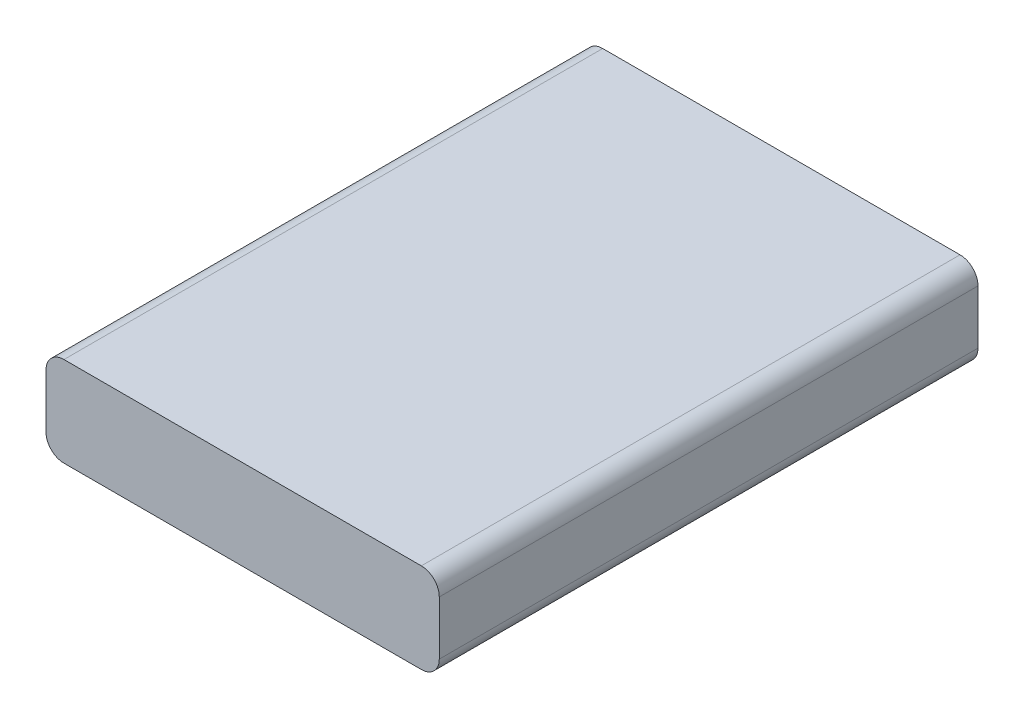
ISO-10303-21;
HEADER;
FILE_DESCRIPTION(('STEP AP214'),'2;1');
FILE_NAME('part.step','',(''),(''),'','','');
FILE_SCHEMA(('AUTOMOTIVE_DESIGN { 1 0 10303 214 1 1 1 1 }'));
ENDSEC;
DATA;
#1=APPLICATION_CONTEXT('core data for automotive mechanical design processes');
#2=APPLICATION_PROTOCOL_DEFINITION('international standard','automotive_design',2000,#1);
#3=PRODUCT_CONTEXT('',#1,'mechanical');
#4=PRODUCT('Part','Part','',(#3));
#5=PRODUCT_RELATED_PRODUCT_CATEGORY('part','',(#4));
#6=PRODUCT_DEFINITION_FORMATION('','',#4);
#7=PRODUCT_DEFINITION_CONTEXT('part definition',#1,'design');
#8=PRODUCT_DEFINITION('design','',#6,#7);
#9=PRODUCT_DEFINITION_SHAPE('','',#8);
#10=(LENGTH_UNIT() NAMED_UNIT(*) SI_UNIT(.MILLI.,.METRE.));
#11=(NAMED_UNIT(*) PLANE_ANGLE_UNIT() SI_UNIT($,.RADIAN.));
#12=(NAMED_UNIT(*) SI_UNIT($,.STERADIAN.) SOLID_ANGLE_UNIT());
#13=UNCERTAINTY_MEASURE_WITH_UNIT(LENGTH_MEASURE(1.E-05),#10,'distance_accuracy_value','');
#14=(GEOMETRIC_REPRESENTATION_CONTEXT(3) GLOBAL_UNCERTAINTY_ASSIGNED_CONTEXT((#13)) GLOBAL_UNIT_ASSIGNED_CONTEXT((#10,
#11,#12)) REPRESENTATION_CONTEXT('',''));
#15=CARTESIAN_POINT('',(0.,0.,0.));
#16=DIRECTION('',(0.,0.,1.));
#17=DIRECTION('',(1.,0.,0.));
#18=AXIS2_PLACEMENT_3D('',#15,#16,#17);
#19=CARTESIAN_POINT('',(10.95,2.5,30.));
#20=DIRECTION('',(-1.,0.,0.));
#21=DIRECTION('',(0.,0.,1.));
#22=AXIS2_PLACEMENT_3D('',#19,#20,#21);
#23=PLANE('',#22);
#24=DIRECTION('',(0.,1.,0.));
#25=VECTOR('',#24,1.);
#26=CARTESIAN_POINT('',(10.95,2.5,30.));
#27=LINE('',#26,#25);
#28=CARTESIAN_POINT('',(10.95,-1.5,30.));
#29=VERTEX_POINT('',#28);
#30=CARTESIAN_POINT('',(10.95,1.5,30.));
#31=VERTEX_POINT('',#30);
#32=EDGE_CURVE('E135',#29,#31,#27,.T.);
#33=ORIENTED_EDGE('',*,*,#32,.F.);
#34=DIRECTION('',(0.,0.,-1.));
#35=VECTOR('',#34,1.);
#36=CARTESIAN_POINT('',(10.95,-1.5,30.));
#37=LINE('',#36,#35);
#38=CARTESIAN_POINT('',(10.95,-1.5,0.));
#39=VERTEX_POINT('',#38);
#40=EDGE_CURVE('E157',#29,#39,#37,.T.);
#41=ORIENTED_EDGE('',*,*,#40,.T.);
#42=DIRECTION('',(0.,1.,0.));
#43=VECTOR('',#42,1.);
#44=CARTESIAN_POINT('',(10.95,2.5,0.));
#45=LINE('',#44,#43);
#46=CARTESIAN_POINT('',(10.95,1.5,0.));
#47=VERTEX_POINT('',#46);
#48=EDGE_CURVE('E134',#39,#47,#45,.T.);
#49=ORIENTED_EDGE('',*,*,#48,.T.);
#50=DIRECTION('',(0.,0.,-1.));
#51=VECTOR('',#50,1.);
#52=CARTESIAN_POINT('',(10.95,1.5,30.));
#53=LINE('',#52,#51);
#54=EDGE_CURVE('E146',#47,#31,#53,.F.);
#55=ORIENTED_EDGE('',*,*,#54,.T.);
#56=EDGE_LOOP('',(#33,#41,#49,#55));
#57=FACE_BOUND('',#56,.T.);
#58=ADVANCED_FACE('F43',(#57),#23,.F.);
#59=CARTESIAN_POINT('',(-10.95,2.5,30.));
#60=DIRECTION('',(0.,-1.,0.));
#61=DIRECTION('',(0.,0.,-1.));
#62=AXIS2_PLACEMENT_3D('',#59,#60,#61);
#63=PLANE('',#62);
#64=DIRECTION('',(-1.,0.,0.));
#65=VECTOR('',#64,1.);
#66=CARTESIAN_POINT('',(-10.95,2.5,0.));
#67=LINE('',#66,#65);
#68=CARTESIAN_POINT('',(9.95,2.5,0.));
#69=VERTEX_POINT('',#68);
#70=CARTESIAN_POINT('',(-9.95,2.5,0.));
#71=VERTEX_POINT('',#70);
#72=EDGE_CURVE('E149',#69,#71,#67,.T.);
#73=ORIENTED_EDGE('',*,*,#72,.T.);
#74=DIRECTION('',(0.,0.,-1.));
#75=VECTOR('',#74,1.);
#76=CARTESIAN_POINT('',(-9.95,2.5,30.));
#77=LINE('',#76,#75);
#78=CARTESIAN_POINT('',(-9.95,2.5,30.));
#79=VERTEX_POINT('',#78);
#80=EDGE_CURVE('E11',#71,#79,#77,.F.);
#81=ORIENTED_EDGE('',*,*,#80,.T.);
#82=DIRECTION('',(-1.,0.,0.));
#83=VECTOR('',#82,1.);
#84=CARTESIAN_POINT('',(-10.95,2.5,30.));
#85=LINE('',#84,#83);
#86=CARTESIAN_POINT('',(9.95,2.5,30.));
#87=VERTEX_POINT('',#86);
#88=EDGE_CURVE('E138',#87,#79,#85,.T.);
#89=ORIENTED_EDGE('',*,*,#88,.F.);
#90=DIRECTION('',(0.,0.,-1.));
#91=VECTOR('',#90,1.);
#92=CARTESIAN_POINT('',(9.95,2.5,30.));
#93=LINE('',#92,#91);
#94=EDGE_CURVE('E51',#87,#69,#93,.T.);
#95=ORIENTED_EDGE('',*,*,#94,.T.);
#96=EDGE_LOOP('',(#73,#81,#89,#95));
#97=FACE_BOUND('',#96,.T.);
#98=ADVANCED_FACE('F188',(#97),#63,.F.);
#99=CARTESIAN_POINT('',(-10.95,2.5,30.));
#100=DIRECTION('',(1.,0.,0.));
#101=DIRECTION('',(0.,0.,-1.));
#102=AXIS2_PLACEMENT_3D('',#99,#100,#101);
#103=PLANE('',#102);
#104=DIRECTION('',(0.,-1.,0.));
#105=VECTOR('',#104,1.);
#106=CARTESIAN_POINT('',(-10.95,2.5,0.));
#107=LINE('',#106,#105);
#108=CARTESIAN_POINT('',(-10.95,1.5,0.));
#109=VERTEX_POINT('',#108);
#110=CARTESIAN_POINT('',(-10.95,-1.5,0.));
#111=VERTEX_POINT('',#110);
#112=EDGE_CURVE('E152',#109,#111,#107,.T.);
#113=ORIENTED_EDGE('',*,*,#112,.T.);
#114=DIRECTION('',(0.,0.,-1.));
#115=VECTOR('',#114,1.);
#116=CARTESIAN_POINT('',(-10.95,-1.5,30.));
#117=LINE('',#116,#115);
#118=CARTESIAN_POINT('',(-10.95,-1.5,30.));
#119=VERTEX_POINT('',#118);
#120=EDGE_CURVE('E58',#111,#119,#117,.F.);
#121=ORIENTED_EDGE('',*,*,#120,.T.);
#122=DIRECTION('',(0.,-1.,0.));
#123=VECTOR('',#122,1.);
#124=CARTESIAN_POINT('',(-10.95,2.5,30.));
#125=LINE('',#124,#123);
#126=CARTESIAN_POINT('',(-10.95,1.5,30.));
#127=VERTEX_POINT('',#126);
#128=EDGE_CURVE('E141',#127,#119,#125,.T.);
#129=ORIENTED_EDGE('',*,*,#128,.F.);
#130=DIRECTION('',(0.,0.,-1.));
#131=VECTOR('',#130,1.);
#132=CARTESIAN_POINT('',(-10.95,1.5,30.));
#133=LINE('',#132,#131);
#134=EDGE_CURVE('E180',#127,#109,#133,.T.);
#135=ORIENTED_EDGE('',*,*,#134,.T.);
#136=EDGE_LOOP('',(#113,#121,#129,#135));
#137=FACE_BOUND('',#136,.T.);
#138=ADVANCED_FACE('F199',(#137),#103,.F.);
#139=CARTESIAN_POINT('',(-10.95,-2.5,30.));
#140=DIRECTION('',(0.,1.,0.));
#141=DIRECTION('',(0.,0.,1.));
#142=AXIS2_PLACEMENT_3D('',#139,#140,#141);
#143=PLANE('',#142);
#144=DIRECTION('',(1.,0.,0.));
#145=VECTOR('',#144,1.);
#146=CARTESIAN_POINT('',(-10.95,-2.5,0.));
#147=LINE('',#146,#145);
#148=CARTESIAN_POINT('',(-9.95,-2.5,0.));
#149=VERTEX_POINT('',#148);
#150=CARTESIAN_POINT('',(9.95,-2.5,0.));
#151=VERTEX_POINT('',#150);
#152=EDGE_CURVE('E139',#149,#151,#147,.T.);
#153=ORIENTED_EDGE('',*,*,#152,.T.);
#154=DIRECTION('',(0.,0.,-1.));
#155=VECTOR('',#154,1.);
#156=CARTESIAN_POINT('',(9.95,-2.5,30.));
#157=LINE('',#156,#155);
#158=CARTESIAN_POINT('',(9.95,-2.5,30.));
#159=VERTEX_POINT('',#158);
#160=EDGE_CURVE('E171',#151,#159,#157,.F.);
#161=ORIENTED_EDGE('',*,*,#160,.T.);
#162=DIRECTION('',(1.,0.,0.));
#163=VECTOR('',#162,1.);
#164=CARTESIAN_POINT('',(-10.95,-2.5,30.));
#165=LINE('',#164,#163);
#166=CARTESIAN_POINT('',(-9.95,-2.5,30.));
#167=VERTEX_POINT('',#166);
#168=EDGE_CURVE('E143',#167,#159,#165,.T.);
#169=ORIENTED_EDGE('',*,*,#168,.F.);
#170=DIRECTION('',(0.,0.,-1.));
#171=VECTOR('',#170,1.);
#172=CARTESIAN_POINT('',(-9.95,-2.5,30.));
#173=LINE('',#172,#171);
#174=EDGE_CURVE('E168',#167,#149,#173,.T.);
#175=ORIENTED_EDGE('',*,*,#174,.T.);
#176=EDGE_LOOP('',(#153,#161,#169,#175));
#177=FACE_BOUND('',#176,.T.);
#178=ADVANCED_FACE('F208',(#177),#143,.F.);
#179=CARTESIAN_POINT('',(0.,0.,30.));
#180=DIRECTION('',(0.,0.,1.));
#181=DIRECTION('',(1.,0.,0.));
#182=AXIS2_PLACEMENT_3D('',#179,#180,#181);
#183=PLANE('',#182);
#184=ORIENTED_EDGE('',*,*,#168,.T.);
#185=CARTESIAN_POINT('',(9.95,-1.5,30.));
#186=DIRECTION('',(0.,0.,1.));
#187=DIRECTION('',(1.,0.,0.));
#188=AXIS2_PLACEMENT_3D('',#185,#186,#187);
#189=CIRCLE('',#188,1.);
#190=EDGE_CURVE('E178',#159,#29,#189,.T.);
#191=ORIENTED_EDGE('',*,*,#190,.T.);
#192=ORIENTED_EDGE('',*,*,#32,.T.);
#193=CARTESIAN_POINT('',(9.95,1.5,30.));
#194=DIRECTION('',(0.,0.,1.));
#195=DIRECTION('',(1.,0.,0.));
#196=AXIS2_PLACEMENT_3D('',#193,#194,#195);
#197=CIRCLE('',#196,1.);
#198=EDGE_CURVE('E173',#31,#87,#197,.T.);
#199=ORIENTED_EDGE('',*,*,#198,.T.);
#200=ORIENTED_EDGE('',*,*,#88,.T.);
#201=CARTESIAN_POINT('',(-9.95,1.5,30.));
#202=DIRECTION('',(0.,0.,1.));
#203=DIRECTION('',(1.,0.,0.));
#204=AXIS2_PLACEMENT_3D('',#201,#202,#203);
#205=CIRCLE('',#204,1.);
#206=EDGE_CURVE('E65',#79,#127,#205,.T.);
#207=ORIENTED_EDGE('',*,*,#206,.T.);
#208=ORIENTED_EDGE('',*,*,#128,.T.);
#209=CARTESIAN_POINT('',(-9.95,-1.5,30.));
#210=DIRECTION('',(0.,0.,1.));
#211=DIRECTION('',(1.,0.,0.));
#212=AXIS2_PLACEMENT_3D('',#209,#210,#211);
#213=CIRCLE('',#212,1.);
#214=EDGE_CURVE('E176',#119,#167,#213,.T.);
#215=ORIENTED_EDGE('',*,*,#214,.T.);
#216=EDGE_LOOP('',(#184,#191,#192,#199,#200,#207,#208,#215));
#217=FACE_BOUND('',#216,.T.);
#218=ADVANCED_FACE('F201',(#217),#183,.T.);
#219=CARTESIAN_POINT('',(0.,0.,0.));
#220=DIRECTION('',(0.,0.,1.));
#221=DIRECTION('',(1.,0.,0.));
#222=AXIS2_PLACEMENT_3D('',#219,#220,#221);
#223=PLANE('',#222);
#224=CARTESIAN_POINT('',(5.,0.,0.));
#225=DIRECTION('',(0.,0.,-1.));
#226=DIRECTION('',(-1.,0.,0.));
#227=AXIS2_PLACEMENT_3D('',#224,#225,#226);
#228=CIRCLE('',#227,1.02499999999999);
#229=CARTESIAN_POINT('',(3.97500000000001,0.,0.));
#230=VERTEX_POINT('',#229);
#231=EDGE_CURVE('E124',#230,#230,#228,.T.);
#232=ORIENTED_EDGE('',*,*,#231,.F.);
#233=EDGE_LOOP('',(#232));
#234=FACE_BOUND('',#233,.T.);
#235=CARTESIAN_POINT('',(-5.,0.,0.));
#236=DIRECTION('',(0.,0.,-1.));
#237=DIRECTION('',(-1.,0.,0.));
#238=AXIS2_PLACEMENT_3D('',#235,#236,#237);
#239=CIRCLE('',#238,1.02499999999999);
#240=CARTESIAN_POINT('',(-6.02499999999999,0.,0.));
#241=VERTEX_POINT('',#240);
#242=EDGE_CURVE('E123',#241,#241,#239,.T.);
#243=ORIENTED_EDGE('',*,*,#242,.F.);
#244=EDGE_LOOP('',(#243));
#245=FACE_BOUND('',#244,.T.);
#246=ORIENTED_EDGE('',*,*,#48,.F.);
#247=CARTESIAN_POINT('',(9.95,-1.5,0.));
#248=DIRECTION('',(0.,0.,1.));
#249=DIRECTION('',(1.,0.,0.));
#250=AXIS2_PLACEMENT_3D('',#247,#248,#249);
#251=CIRCLE('',#250,1.);
#252=EDGE_CURVE('E166',#39,#151,#251,.F.);
#253=ORIENTED_EDGE('',*,*,#252,.T.);
#254=ORIENTED_EDGE('',*,*,#152,.F.);
#255=CARTESIAN_POINT('',(-9.95,-1.5,0.));
#256=DIRECTION('',(0.,0.,1.));
#257=DIRECTION('',(1.,0.,0.));
#258=AXIS2_PLACEMENT_3D('',#255,#256,#257);
#259=CIRCLE('',#258,1.);
#260=EDGE_CURVE('E164',#149,#111,#259,.F.);
#261=ORIENTED_EDGE('',*,*,#260,.T.);
#262=ORIENTED_EDGE('',*,*,#112,.F.);
#263=CARTESIAN_POINT('',(-9.95,1.5,0.));
#264=DIRECTION('',(0.,0.,1.));
#265=DIRECTION('',(1.,0.,0.));
#266=AXIS2_PLACEMENT_3D('',#263,#264,#265);
#267=CIRCLE('',#266,1.);
#268=EDGE_CURVE('E162',#109,#71,#267,.F.);
#269=ORIENTED_EDGE('',*,*,#268,.T.);
#270=ORIENTED_EDGE('',*,*,#72,.F.);
#271=CARTESIAN_POINT('',(9.95,1.5,0.));
#272=DIRECTION('',(0.,0.,1.));
#273=DIRECTION('',(1.,0.,0.));
#274=AXIS2_PLACEMENT_3D('',#271,#272,#273);
#275=CIRCLE('',#274,1.);
#276=EDGE_CURVE('E160',#69,#47,#275,.F.);
#277=ORIENTED_EDGE('',*,*,#276,.T.);
#278=EDGE_LOOP('',(#246,#253,#254,#261,#262,#269,#270,#277));
#279=FACE_BOUND('',#278,.T.);
#280=ADVANCED_FACE('F194',(#234,#245,#279),#223,.F.);
#281=CARTESIAN_POINT('',(9.95,-1.5,30.));
#282=DIRECTION('',(0.,0.,-1.));
#283=DIRECTION('',(-1.,0.,0.));
#284=AXIS2_PLACEMENT_3D('',#281,#282,#283);
#285=CYLINDRICAL_SURFACE('',#284,1.);
#286=ORIENTED_EDGE('',*,*,#190,.F.);
#287=ORIENTED_EDGE('',*,*,#160,.F.);
#288=ORIENTED_EDGE('',*,*,#252,.F.);
#289=ORIENTED_EDGE('',*,*,#40,.F.);
#290=EDGE_LOOP('',(#286,#287,#288,#289));
#291=FACE_BOUND('',#290,.T.);
#292=ADVANCED_FACE('F213',(#291),#285,.T.);
#293=CARTESIAN_POINT('',(-9.95,-1.5,30.));
#294=DIRECTION('',(0.,0.,-1.));
#295=DIRECTION('',(-1.,0.,0.));
#296=AXIS2_PLACEMENT_3D('',#293,#294,#295);
#297=CYLINDRICAL_SURFACE('',#296,1.);
#298=ORIENTED_EDGE('',*,*,#214,.F.);
#299=ORIENTED_EDGE('',*,*,#120,.F.);
#300=ORIENTED_EDGE('',*,*,#260,.F.);
#301=ORIENTED_EDGE('',*,*,#174,.F.);
#302=EDGE_LOOP('',(#298,#299,#300,#301));
#303=FACE_BOUND('',#302,.T.);
#304=ADVANCED_FACE('F205',(#303),#297,.T.);
#305=CARTESIAN_POINT('',(-9.95,1.5,30.));
#306=DIRECTION('',(0.,0.,-1.));
#307=DIRECTION('',(-1.,0.,0.));
#308=AXIS2_PLACEMENT_3D('',#305,#306,#307);
#309=CYLINDRICAL_SURFACE('',#308,1.);
#310=ORIENTED_EDGE('',*,*,#206,.F.);
#311=ORIENTED_EDGE('',*,*,#80,.F.);
#312=ORIENTED_EDGE('',*,*,#268,.F.);
#313=ORIENTED_EDGE('',*,*,#134,.F.);
#314=EDGE_LOOP('',(#310,#311,#312,#313));
#315=FACE_BOUND('',#314,.T.);
#316=ADVANCED_FACE('F198',(#315),#309,.T.);
#317=CARTESIAN_POINT('',(9.95,1.5,30.));
#318=DIRECTION('',(0.,0.,-1.));
#319=DIRECTION('',(-1.,0.,0.));
#320=AXIS2_PLACEMENT_3D('',#317,#318,#319);
#321=CYLINDRICAL_SURFACE('',#320,1.);
#322=ORIENTED_EDGE('',*,*,#198,.F.);
#323=ORIENTED_EDGE('',*,*,#54,.F.);
#324=ORIENTED_EDGE('',*,*,#276,.F.);
#325=ORIENTED_EDGE('',*,*,#94,.F.);
#326=EDGE_LOOP('',(#322,#323,#324,#325));
#327=FACE_BOUND('',#326,.T.);
#328=ADVANCED_FACE('F45',(#327),#321,.T.);
#329=CARTESIAN_POINT('',(-5.,0.,7.25000000000001));
#330=DIRECTION('',(0.,0.,-1.));
#331=DIRECTION('',(-1.,0.,0.));
#332=AXIS2_PLACEMENT_3D('',#329,#330,#331);
#333=CONICAL_SURFACE('',#332,1.02499999999999,1.02974425867665);
#334=CARTESIAN_POINT('',(-5.,0.,7.86588213450325));
#335=VERTEX_POINT('',#334);
#336=VERTEX_LOOP('',#335);
#337=FACE_BOUND('',#336,.T.);
#338=CARTESIAN_POINT('',(-5.,0.,7.25000000000001));
#339=DIRECTION('',(0.,0.,-1.));
#340=DIRECTION('',(-1.,0.,0.));
#341=AXIS2_PLACEMENT_3D('',#338,#339,#340);
#342=CIRCLE('',#341,1.02499999999999);
#343=CARTESIAN_POINT('',(-6.02499999999999,0.,7.25000000000001));
#344=VERTEX_POINT('',#343);
#345=EDGE_CURVE('E127',#344,#344,#342,.T.);
#346=ORIENTED_EDGE('',*,*,#345,.T.);
#347=EDGE_LOOP('',(#346));
#348=FACE_BOUND('',#347,.T.);
#349=ADVANCED_FACE('F218',(#337,#348),#333,.F.);
#350=CARTESIAN_POINT('',(-5.,0.,0.));
#351=DIRECTION('',(0.,0.,-1.));
#352=DIRECTION('',(-1.,0.,0.));
#353=AXIS2_PLACEMENT_3D('',#350,#351,#352);
#354=CYLINDRICAL_SURFACE('',#353,1.02499999999999);
#355=ORIENTED_EDGE('',*,*,#345,.F.);
#356=EDGE_LOOP('',(#355));
#357=FACE_BOUND('',#356,.T.);
#358=ORIENTED_EDGE('',*,*,#242,.T.);
#359=EDGE_LOOP('',(#358));
#360=FACE_BOUND('',#359,.T.);
#361=ADVANCED_FACE('F117',(#357,#360),#354,.F.);
#362=CARTESIAN_POINT('',(5.,0.,7.25000000000001));
#363=DIRECTION('',(0.,0.,-1.));
#364=DIRECTION('',(-1.,0.,0.));
#365=AXIS2_PLACEMENT_3D('',#362,#363,#364);
#366=CONICAL_SURFACE('',#365,1.02499999999999,1.02974425867665);
#367=CARTESIAN_POINT('',(5.,0.,7.86588213450325));
#368=VERTEX_POINT('',#367);
#369=VERTEX_LOOP('',#368);
#370=FACE_BOUND('',#369,.T.);
#371=CARTESIAN_POINT('',(5.,0.,7.25000000000001));
#372=DIRECTION('',(0.,0.,-1.));
#373=DIRECTION('',(-1.,0.,0.));
#374=AXIS2_PLACEMENT_3D('',#371,#372,#373);
#375=CIRCLE('',#374,1.02499999999999);
#376=CARTESIAN_POINT('',(3.97500000000001,0.,7.25000000000001));
#377=VERTEX_POINT('',#376);
#378=EDGE_CURVE('E121',#377,#377,#375,.T.);
#379=ORIENTED_EDGE('',*,*,#378,.T.);
#380=EDGE_LOOP('',(#379));
#381=FACE_BOUND('',#380,.T.);
#382=ADVANCED_FACE('F113',(#370,#381),#366,.F.);
#383=CARTESIAN_POINT('',(5.,0.,0.));
#384=DIRECTION('',(0.,0.,-1.));
#385=DIRECTION('',(-1.,0.,0.));
#386=AXIS2_PLACEMENT_3D('',#383,#384,#385);
#387=CYLINDRICAL_SURFACE('',#386,1.02499999999999);
#388=ORIENTED_EDGE('',*,*,#378,.F.);
#389=EDGE_LOOP('',(#388));
#390=FACE_BOUND('',#389,.T.);
#391=ORIENTED_EDGE('',*,*,#231,.T.);
#392=EDGE_LOOP('',(#391));
#393=FACE_BOUND('',#392,.T.);
#394=ADVANCED_FACE('F116',(#390,#393),#387,.F.);
#395=CLOSED_SHELL('',(#58,#98,#138,#178,#218,#280,#292,#304,#316,#328,#349,#361,#382,#394));
#396=MANIFOLD_SOLID_BREP('B2',#395);
#397=ADVANCED_BREP_SHAPE_REPRESENTATION('',(#18,#396),#14);
#398=SHAPE_DEFINITION_REPRESENTATION(#9,#397);
ENDSEC;
END-ISO-10303-21;
